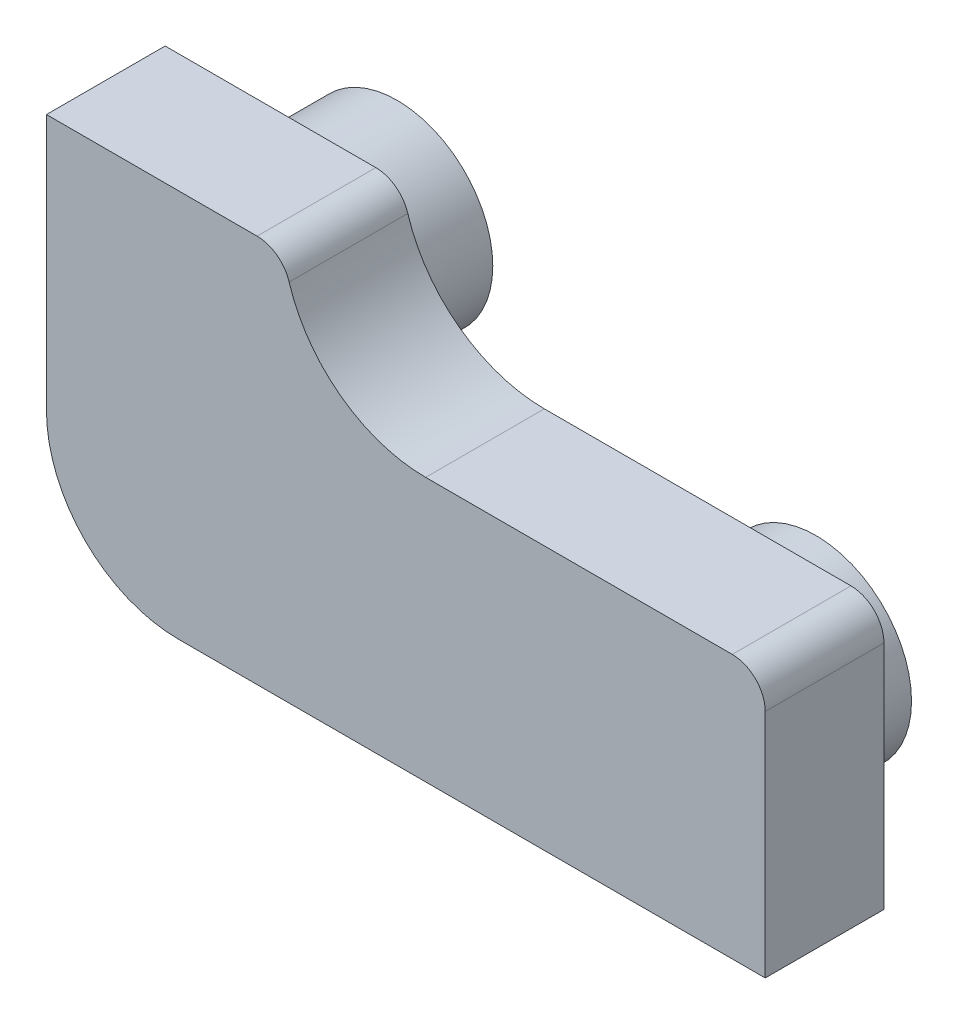
ISO-10303-21;
HEADER;
FILE_DESCRIPTION(('STEP AP214'),'2;1');
FILE_NAME('part.step','',(''),(''),'','','');
FILE_SCHEMA(('AUTOMOTIVE_DESIGN { 1 0 10303 214 1 1 1 1 }'));
ENDSEC;
DATA;
#1=APPLICATION_CONTEXT('core data for automotive mechanical design processes');
#2=APPLICATION_PROTOCOL_DEFINITION('international standard','automotive_design',2000,#1);
#3=PRODUCT_CONTEXT('',#1,'mechanical');
#4=PRODUCT('Part','Part','',(#3));
#5=PRODUCT_RELATED_PRODUCT_CATEGORY('part','',(#4));
#6=PRODUCT_DEFINITION_FORMATION('','',#4);
#7=PRODUCT_DEFINITION_CONTEXT('part definition',#1,'design');
#8=PRODUCT_DEFINITION('design','',#6,#7);
#9=PRODUCT_DEFINITION_SHAPE('','',#8);
#10=(LENGTH_UNIT() NAMED_UNIT(*) SI_UNIT(.MILLI.,.METRE.));
#11=(NAMED_UNIT(*) PLANE_ANGLE_UNIT() SI_UNIT($,.RADIAN.));
#12=(NAMED_UNIT(*) SI_UNIT($,.STERADIAN.) SOLID_ANGLE_UNIT());
#13=UNCERTAINTY_MEASURE_WITH_UNIT(LENGTH_MEASURE(1.E-05),#10,'distance_accuracy_value','');
#14=(GEOMETRIC_REPRESENTATION_CONTEXT(3) GLOBAL_UNCERTAINTY_ASSIGNED_CONTEXT((#13)) GLOBAL_UNIT_ASSIGNED_CONTEXT((#10,
#11,#12)) REPRESENTATION_CONTEXT('',''));
#15=CARTESIAN_POINT('',(0.,0.,0.));
#16=DIRECTION('',(0.,0.,1.));
#17=DIRECTION('',(1.,0.,0.));
#18=AXIS2_PLACEMENT_3D('',#15,#16,#17);
#19=CARTESIAN_POINT('',(2.54,-5.08,-1.25));
#20=DIRECTION('',(0.,0.,1.));
#21=DIRECTION('',(1.,0.,0.));
#22=AXIS2_PLACEMENT_3D('',#19,#20,#21);
#23=PLANE('',#22);
#24=CARTESIAN_POINT('',(2.54,-5.08,-1.25));
#25=DIRECTION('',(0.,0.,1.));
#26=DIRECTION('',(1.,0.,0.));
#27=AXIS2_PLACEMENT_3D('',#24,#25,#26);
#28=CIRCLE('',#27,1.45);
#29=CARTESIAN_POINT('',(3.99,-5.08,-1.25));
#30=VERTEX_POINT('',#29);
#31=EDGE_CURVE('E19',#30,#30,#28,.T.);
#32=ORIENTED_EDGE('',*,*,#31,.F.);
#33=EDGE_LOOP('',(#32));
#34=FACE_BOUND('',#33,.T.);
#35=ADVANCED_FACE('F16',(#34),#23,.F.);
#36=CARTESIAN_POINT('',(-3.81,-2.54,-1.25));
#37=DIRECTION('',(0.,0.,1.));
#38=DIRECTION('',(1.,0.,0.));
#39=AXIS2_PLACEMENT_3D('',#36,#37,#38);
#40=PLANE('',#39);
#41=CARTESIAN_POINT('',(-3.81,-2.54,-1.25));
#42=DIRECTION('',(0.,0.,1.));
#43=DIRECTION('',(1.,0.,0.));
#44=AXIS2_PLACEMENT_3D('',#41,#42,#43);
#45=CIRCLE('',#44,1.45);
#46=CARTESIAN_POINT('',(-2.36,-2.54,-1.25));
#47=VERTEX_POINT('',#46);
#48=EDGE_CURVE('E156',#47,#47,#45,.T.);
#49=ORIENTED_EDGE('',*,*,#48,.F.);
#50=EDGE_LOOP('',(#49));
#51=FACE_BOUND('',#50,.T.);
#52=ADVANCED_FACE('F166',(#51),#40,.F.);
#53=CARTESIAN_POINT('',(2.54,-5.08,-1.25));
#54=DIRECTION('',(0.,0.,1.));
#55=DIRECTION('',(1.,0.,0.));
#56=AXIS2_PLACEMENT_3D('',#53,#54,#55);
#57=CYLINDRICAL_SURFACE('',#56,1.45);
#58=CARTESIAN_POINT('',(2.54,-5.08,0.));
#59=DIRECTION('',(0.,0.,1.));
#60=DIRECTION('',(1.,0.,0.));
#61=AXIS2_PLACEMENT_3D('',#58,#59,#60);
#62=CIRCLE('',#61,1.45);
#63=CARTESIAN_POINT('',(3.99,-5.08,0.));
#64=VERTEX_POINT('',#63);
#65=EDGE_CURVE('E151',#64,#64,#62,.T.);
#66=ORIENTED_EDGE('',*,*,#65,.F.);
#67=EDGE_LOOP('',(#66));
#68=FACE_BOUND('',#67,.T.);
#69=ORIENTED_EDGE('',*,*,#31,.T.);
#70=EDGE_LOOP('',(#69));
#71=FACE_BOUND('',#70,.T.);
#72=ADVANCED_FACE('F163',(#68,#71),#57,.T.);
#73=CARTESIAN_POINT('',(-3.81,-2.54,-1.25));
#74=DIRECTION('',(0.,0.,1.));
#75=DIRECTION('',(1.,0.,0.));
#76=AXIS2_PLACEMENT_3D('',#73,#74,#75);
#77=CYLINDRICAL_SURFACE('',#76,1.45);
#78=ORIENTED_EDGE('',*,*,#48,.T.);
#79=EDGE_LOOP('',(#78));
#80=FACE_BOUND('',#79,.T.);
#81=CARTESIAN_POINT('',(-3.81,-2.54,0.));
#82=DIRECTION('',(0.,0.,1.));
#83=DIRECTION('',(1.,0.,0.));
#84=AXIS2_PLACEMENT_3D('',#81,#82,#83);
#85=CIRCLE('',#84,1.45);
#86=CARTESIAN_POINT('',(-2.36,-2.54,0.));
#87=VERTEX_POINT('',#86);
#88=EDGE_CURVE('E148',#87,#87,#85,.T.);
#89=ORIENTED_EDGE('',*,*,#88,.F.);
#90=EDGE_LOOP('',(#89));
#91=FACE_BOUND('',#90,.T.);
#92=ADVANCED_FACE('F212',(#80,#91),#77,.T.);
#93=CARTESIAN_POINT('',(-2.88432518583022,-1.39419157621007,1.8));
#94=DIRECTION('',(0.,0.,-1.));
#95=DIRECTION('',(-1.,0.,0.));
#96=AXIS2_PLACEMENT_3D('',#93,#94,#95);
#97=CYLINDRICAL_SURFACE('',#96,0.508);
#98=CARTESIAN_POINT('',(-2.88432518583022,-1.39419157621007,1.8));
#99=DIRECTION('',(0.,0.,-1.));
#100=DIRECTION('',(-1.,0.,0.));
#101=AXIS2_PLACEMENT_3D('',#98,#99,#100);
#102=CIRCLE('',#101,0.508);
#103=CARTESIAN_POINT('',(-2.88432518583022,-0.886191576210072,1.8));
#104=VERTEX_POINT('',#103);
#105=CARTESIAN_POINT('',(-2.39862159120643,-1.24534259848589,1.8));
#106=VERTEX_POINT('',#105);
#107=EDGE_CURVE('E78',#104,#106,#102,.T.);
#108=ORIENTED_EDGE('',*,*,#107,.T.);
#109=DIRECTION('',(0.,0.,-1.));
#110=VECTOR('',#109,1.);
#111=CARTESIAN_POINT('',(-2.39862159120643,-1.24534259848589,1.8));
#112=LINE('',#111,#110);
#113=CARTESIAN_POINT('',(-2.39862159120643,-1.24534259848589,0.));
#114=VERTEX_POINT('',#113);
#115=EDGE_CURVE('E99',#106,#114,#112,.T.);
#116=ORIENTED_EDGE('',*,*,#115,.T.);
#117=CARTESIAN_POINT('',(-2.88432518583022,-1.39419157621007,0.));
#118=DIRECTION('',(0.,0.,-1.));
#119=DIRECTION('',(-1.,0.,0.));
#120=AXIS2_PLACEMENT_3D('',#117,#118,#119);
#121=CIRCLE('',#120,0.508);
#122=CARTESIAN_POINT('',(-2.88432518583022,-0.886191576210072,0.));
#123=VERTEX_POINT('',#122);
#124=EDGE_CURVE('E146',#123,#114,#121,.T.);
#125=ORIENTED_EDGE('',*,*,#124,.F.);
#126=DIRECTION('',(0.,0.,1.));
#127=VECTOR('',#126,1.);
#128=CARTESIAN_POINT('',(-2.88432518583022,-0.886191576210072,1.8));
#129=LINE('',#128,#127);
#130=EDGE_CURVE('E95',#123,#104,#129,.T.);
#131=ORIENTED_EDGE('',*,*,#130,.T.);
#132=EDGE_LOOP('',(#108,#116,#125,#131));
#133=FACE_BOUND('',#132,.T.);
#134=ADVANCED_FACE('F208',(#133),#97,.T.);
#135=CARTESIAN_POINT('',(4.3216463606853,-3.27619157621007,1.8));
#136=DIRECTION('',(0.,0.,-1.));
#137=DIRECTION('',(-1.,0.,0.));
#138=AXIS2_PLACEMENT_3D('',#135,#136,#137);
#139=CYLINDRICAL_SURFACE('',#138,0.5);
#140=CARTESIAN_POINT('',(4.3216463606853,-3.27619157621007,1.8));
#141=DIRECTION('',(0.,0.,-1.));
#142=DIRECTION('',(-1.,0.,0.));
#143=AXIS2_PLACEMENT_3D('',#140,#141,#142);
#144=CIRCLE('',#143,0.5);
#145=CARTESIAN_POINT('',(4.3216463606853,-2.77619157621007,1.8));
#146=VERTEX_POINT('',#145);
#147=CARTESIAN_POINT('',(4.8216463606853,-3.27619157621007,1.8));
#148=VERTEX_POINT('',#147);
#149=EDGE_CURVE('E154',#146,#148,#144,.T.);
#150=ORIENTED_EDGE('',*,*,#149,.T.);
#151=DIRECTION('',(0.,0.,1.));
#152=VECTOR('',#151,1.);
#153=CARTESIAN_POINT('',(4.8216463606853,-3.27619157621007,1.8));
#154=LINE('',#153,#152);
#155=CARTESIAN_POINT('',(4.8216463606853,-3.27619157621007,0.));
#156=VERTEX_POINT('',#155);
#157=EDGE_CURVE('E127',#148,#156,#154,.F.);
#158=ORIENTED_EDGE('',*,*,#157,.T.);
#159=CARTESIAN_POINT('',(4.3216463606853,-3.27619157621007,0.));
#160=DIRECTION('',(0.,0.,-1.));
#161=DIRECTION('',(-1.,0.,0.));
#162=AXIS2_PLACEMENT_3D('',#159,#160,#161);
#163=CIRCLE('',#162,0.5);
#164=CARTESIAN_POINT('',(4.3216463606853,-2.77619157621007,0.));
#165=VERTEX_POINT('',#164);
#166=EDGE_CURVE('E144',#165,#156,#163,.T.);
#167=ORIENTED_EDGE('',*,*,#166,.F.);
#168=DIRECTION('',(0.,0.,-1.));
#169=VECTOR('',#168,1.);
#170=CARTESIAN_POINT('',(4.3216463606853,-2.77619157621007,1.8));
#171=LINE('',#170,#169);
#172=EDGE_CURVE('E143',#165,#146,#171,.F.);
#173=ORIENTED_EDGE('',*,*,#172,.T.);
#174=EDGE_LOOP('',(#150,#158,#167,#173));
#175=FACE_BOUND('',#174,.T.);
#176=ADVANCED_FACE('F205',(#175),#139,.T.);
#177=CARTESIAN_POINT('',(-2.88432518583022,-1.39419157621007,0.));
#178=DIRECTION('',(0.,0.,-1.));
#179=DIRECTION('',(-1.,0.,0.));
#180=AXIS2_PLACEMENT_3D('',#177,#178,#179);
#181=PLANE('',#180);
#182=DIRECTION('',(-1.,0.,0.));
#183=VECTOR('',#182,1.);
#184=CARTESIAN_POINT('',(4.8216463606853,-6.77619157621007,0.));
#185=LINE('',#184,#183);
#186=CARTESIAN_POINT('',(4.8216463606853,-6.77619157621007,0.));
#187=VERTEX_POINT('',#186);
#188=CARTESIAN_POINT('',(-4.07835363931469,-6.77619157621007,0.));
#189=VERTEX_POINT('',#188);
#190=EDGE_CURVE('E120',#187,#189,#185,.T.);
#191=ORIENTED_EDGE('',*,*,#190,.T.);
#192=CARTESIAN_POINT('',(-4.0783536393147,-4.77619157621007,0.));
#193=DIRECTION('',(0.,0.,-1.));
#194=DIRECTION('',(-1.,0.,0.));
#195=AXIS2_PLACEMENT_3D('',#192,#193,#194);
#196=CIRCLE('',#195,2.);
#197=CARTESIAN_POINT('',(-6.0783536393147,-4.77619157621006,0.));
#198=VERTEX_POINT('',#197);
#199=EDGE_CURVE('E108',#198,#189,#196,.F.);
#200=ORIENTED_EDGE('',*,*,#199,.F.);
#201=DIRECTION('',(0.,1.,0.));
#202=VECTOR('',#201,1.);
#203=CARTESIAN_POINT('',(-6.0783536393147,-4.77619157621006,0.));
#204=LINE('',#203,#202);
#205=CARTESIAN_POINT('',(-6.0783536393147,-0.886191576210072,0.));
#206=VERTEX_POINT('',#205);
#207=EDGE_CURVE('E102',#198,#206,#204,.T.);
#208=ORIENTED_EDGE('',*,*,#207,.T.);
#209=DIRECTION('',(1.,0.,0.));
#210=VECTOR('',#209,1.);
#211=CARTESIAN_POINT('',(-6.0783536393147,-0.886191576210072,0.));
#212=LINE('',#211,#210);
#213=EDGE_CURVE('E91',#206,#123,#212,.T.);
#214=ORIENTED_EDGE('',*,*,#213,.T.);
#215=ORIENTED_EDGE('',*,*,#124,.T.);
#216=CARTESIAN_POINT('',(-0.328353639314698,-0.61088719880347,0.));
#217=DIRECTION('',(0.,0.,-1.));
#218=DIRECTION('',(-1.,0.,0.));
#219=AXIS2_PLACEMENT_3D('',#216,#217,#218);
#220=CIRCLE('',#219,2.1653043774066);
#221=CARTESIAN_POINT('',(-0.328353639314698,-2.77619157621007,0.));
#222=VERTEX_POINT('',#221);
#223=EDGE_CURVE('E141',#114,#222,#220,.F.);
#224=ORIENTED_EDGE('',*,*,#223,.T.);
#225=DIRECTION('',(1.,0.,0.));
#226=VECTOR('',#225,1.);
#227=CARTESIAN_POINT('',(-0.328353639314698,-2.77619157621007,0.));
#228=LINE('',#227,#226);
#229=EDGE_CURVE('E130',#222,#165,#228,.T.);
#230=ORIENTED_EDGE('',*,*,#229,.T.);
#231=ORIENTED_EDGE('',*,*,#166,.T.);
#232=DIRECTION('',(0.,1.,0.));
#233=VECTOR('',#232,1.);
#234=CARTESIAN_POINT('',(4.8216463606853,-3.27619157621007,0.));
#235=LINE('',#234,#233);
#236=EDGE_CURVE('E125',#156,#187,#235,.F.);
#237=ORIENTED_EDGE('',*,*,#236,.T.);
#238=EDGE_LOOP('',(#191,#200,#208,#214,#215,#224,#230,#231,#237));
#239=FACE_BOUND('',#238,.T.);
#240=ORIENTED_EDGE('',*,*,#88,.T.);
#241=EDGE_LOOP('',(#240));
#242=FACE_BOUND('',#241,.T.);
#243=ORIENTED_EDGE('',*,*,#65,.T.);
#244=EDGE_LOOP('',(#243));
#245=FACE_BOUND('',#244,.T.);
#246=ADVANCED_FACE('F106',(#239,#242,#245),#181,.T.);
#247=CARTESIAN_POINT('',(-6.0783536393147,-0.886191576210072,1.8));
#248=DIRECTION('',(0.,-1.,0.));
#249=DIRECTION('',(1.,0.,0.));
#250=AXIS2_PLACEMENT_3D('',#247,#248,#249);
#251=PLANE('',#250);
#252=DIRECTION('',(0.,0.,-1.));
#253=VECTOR('',#252,1.);
#254=CARTESIAN_POINT('',(-6.0783536393147,-0.886191576210072,1.8));
#255=LINE('',#254,#253);
#256=CARTESIAN_POINT('',(-6.0783536393147,-0.886191576210072,1.8));
#257=VERTEX_POINT('',#256);
#258=EDGE_CURVE('E94',#206,#257,#255,.F.);
#259=ORIENTED_EDGE('',*,*,#258,.T.);
#260=DIRECTION('',(-1.,0.,0.));
#261=VECTOR('',#260,1.);
#262=CARTESIAN_POINT('',(-2.88432518583022,-0.886191576210072,1.8));
#263=LINE('',#262,#261);
#264=EDGE_CURVE('E82',#257,#104,#263,.F.);
#265=ORIENTED_EDGE('',*,*,#264,.T.);
#266=ORIENTED_EDGE('',*,*,#130,.F.);
#267=ORIENTED_EDGE('',*,*,#213,.F.);
#268=EDGE_LOOP('',(#259,#265,#266,#267));
#269=FACE_BOUND('',#268,.T.);
#270=ADVANCED_FACE('F93',(#269),#251,.F.);
#271=CARTESIAN_POINT('',(-0.328353639314698,-0.61088719880347,1.8));
#272=DIRECTION('',(0.,0.,-1.));
#273=DIRECTION('',(-1.,0.,0.));
#274=AXIS2_PLACEMENT_3D('',#271,#272,#273);
#275=CYLINDRICAL_SURFACE('',#274,2.1653043774066);
#276=ORIENTED_EDGE('',*,*,#115,.F.);
#277=CARTESIAN_POINT('',(-0.328353639314698,-0.61088719880347,1.8));
#278=DIRECTION('',(0.,0.,-1.));
#279=DIRECTION('',(-1.,0.,0.));
#280=AXIS2_PLACEMENT_3D('',#277,#278,#279);
#281=CIRCLE('',#280,2.1653043774066);
#282=CARTESIAN_POINT('',(-0.328353639314698,-2.77619157621007,1.8));
#283=VERTEX_POINT('',#282);
#284=EDGE_CURVE('E110',#106,#283,#281,.F.);
#285=ORIENTED_EDGE('',*,*,#284,.T.);
#286=DIRECTION('',(0.,0.,-1.));
#287=VECTOR('',#286,1.);
#288=CARTESIAN_POINT('',(-0.328353639314698,-2.77619157621007,1.8));
#289=LINE('',#288,#287);
#290=EDGE_CURVE('E133',#283,#222,#289,.T.);
#291=ORIENTED_EDGE('',*,*,#290,.T.);
#292=ORIENTED_EDGE('',*,*,#223,.F.);
#293=EDGE_LOOP('',(#276,#285,#291,#292));
#294=FACE_BOUND('',#293,.T.);
#295=ADVANCED_FACE('F196',(#294),#275,.F.);
#296=CARTESIAN_POINT('',(-0.328353639314698,-2.77619157621007,1.8));
#297=DIRECTION('',(0.,-1.,0.));
#298=DIRECTION('',(0.,0.,-1.));
#299=AXIS2_PLACEMENT_3D('',#296,#297,#298);
#300=PLANE('',#299);
#301=ORIENTED_EDGE('',*,*,#290,.F.);
#302=DIRECTION('',(-1.,0.,0.));
#303=VECTOR('',#302,1.);
#304=CARTESIAN_POINT('',(-2.88432518583022,-2.77619157621007,1.8));
#305=LINE('',#304,#303);
#306=EDGE_CURVE('E139',#283,#146,#305,.F.);
#307=ORIENTED_EDGE('',*,*,#306,.T.);
#308=ORIENTED_EDGE('',*,*,#172,.F.);
#309=ORIENTED_EDGE('',*,*,#229,.F.);
#310=EDGE_LOOP('',(#301,#307,#308,#309));
#311=FACE_BOUND('',#310,.T.);
#312=ADVANCED_FACE('F192',(#311),#300,.F.);
#313=CARTESIAN_POINT('',(4.8216463606853,-3.27619157621007,1.8));
#314=DIRECTION('',(-1.,0.,0.));
#315=DIRECTION('',(0.,0.,1.));
#316=AXIS2_PLACEMENT_3D('',#313,#314,#315);
#317=PLANE('',#316);
#318=ORIENTED_EDGE('',*,*,#157,.F.);
#319=DIRECTION('',(0.,1.,0.));
#320=VECTOR('',#319,1.);
#321=CARTESIAN_POINT('',(4.8216463606853,-1.39419157621007,1.8));
#322=LINE('',#321,#320);
#323=CARTESIAN_POINT('',(4.8216463606853,-6.77619157621007,1.8));
#324=VERTEX_POINT('',#323);
#325=EDGE_CURVE('E328',#148,#324,#322,.F.);
#326=ORIENTED_EDGE('',*,*,#325,.T.);
#327=DIRECTION('',(0.,0.,1.));
#328=VECTOR('',#327,1.);
#329=CARTESIAN_POINT('',(4.8216463606853,-6.77619157621007,1.8));
#330=LINE('',#329,#328);
#331=EDGE_CURVE('E122',#324,#187,#330,.F.);
#332=ORIENTED_EDGE('',*,*,#331,.T.);
#333=ORIENTED_EDGE('',*,*,#236,.F.);
#334=EDGE_LOOP('',(#318,#326,#332,#333));
#335=FACE_BOUND('',#334,.T.);
#336=ADVANCED_FACE('F188',(#335),#317,.F.);
#337=CARTESIAN_POINT('',(4.8216463606853,-6.77619157621007,1.8));
#338=DIRECTION('',(0.,1.,0.));
#339=DIRECTION('',(-1.,0.,0.));
#340=AXIS2_PLACEMENT_3D('',#337,#338,#339);
#341=PLANE('',#340);
#342=ORIENTED_EDGE('',*,*,#331,.F.);
#343=DIRECTION('',(-1.,0.,0.));
#344=VECTOR('',#343,1.);
#345=CARTESIAN_POINT('',(-2.88432518583022,-6.77619157621007,1.8));
#346=LINE('',#345,#344);
#347=CARTESIAN_POINT('',(-4.07835363931469,-6.77619157621007,1.8));
#348=VERTEX_POINT('',#347);
#349=EDGE_CURVE('E136',#324,#348,#346,.T.);
#350=ORIENTED_EDGE('',*,*,#349,.T.);
#351=DIRECTION('',(0.,0.,-1.));
#352=VECTOR('',#351,1.);
#353=CARTESIAN_POINT('',(-4.07835363931468,-6.77619157621007,1.8));
#354=LINE('',#353,#352);
#355=EDGE_CURVE('E103',#189,#348,#354,.F.);
#356=ORIENTED_EDGE('',*,*,#355,.F.);
#357=ORIENTED_EDGE('',*,*,#190,.F.);
#358=EDGE_LOOP('',(#342,#350,#356,#357));
#359=FACE_BOUND('',#358,.T.);
#360=ADVANCED_FACE('F184',(#359),#341,.F.);
#361=CARTESIAN_POINT('',(-4.0783536393147,-4.77619157621007,1.8));
#362=DIRECTION('',(0.,0.,-1.));
#363=DIRECTION('',(-1.,0.,0.));
#364=AXIS2_PLACEMENT_3D('',#361,#362,#363);
#365=CYLINDRICAL_SURFACE('',#364,2.);
#366=CARTESIAN_POINT('',(-4.0783536393147,-4.77619157621007,1.8));
#367=DIRECTION('',(0.,0.,-1.));
#368=DIRECTION('',(-1.,0.,0.));
#369=AXIS2_PLACEMENT_3D('',#366,#367,#368);
#370=CIRCLE('',#369,2.);
#371=CARTESIAN_POINT('',(-6.0783536393147,-4.77619157621006,1.8));
#372=VERTEX_POINT('',#371);
#373=EDGE_CURVE('E25',#348,#372,#370,.T.);
#374=ORIENTED_EDGE('',*,*,#373,.T.);
#375=DIRECTION('',(0.,0.,-1.));
#376=VECTOR('',#375,1.);
#377=CARTESIAN_POINT('',(-6.0783536393147,-4.77619157621006,1.8));
#378=LINE('',#377,#376);
#379=EDGE_CURVE('E33',#372,#198,#378,.T.);
#380=ORIENTED_EDGE('',*,*,#379,.T.);
#381=ORIENTED_EDGE('',*,*,#199,.T.);
#382=ORIENTED_EDGE('',*,*,#355,.T.);
#383=EDGE_LOOP('',(#374,#380,#381,#382));
#384=FACE_BOUND('',#383,.T.);
#385=ADVANCED_FACE('F178',(#384),#365,.T.);
#386=CARTESIAN_POINT('',(-6.0783536393147,-4.77619157621006,1.8));
#387=DIRECTION('',(1.,0.,0.));
#388=DIRECTION('',(0.,0.,-1.));
#389=AXIS2_PLACEMENT_3D('',#386,#387,#388);
#390=PLANE('',#389);
#391=ORIENTED_EDGE('',*,*,#379,.F.);
#392=DIRECTION('',(0.,1.,0.));
#393=VECTOR('',#392,1.);
#394=CARTESIAN_POINT('',(-6.0783536393147,-1.39419157621007,1.8));
#395=LINE('',#394,#393);
#396=EDGE_CURVE('E11',#372,#257,#395,.T.);
#397=ORIENTED_EDGE('',*,*,#396,.T.);
#398=ORIENTED_EDGE('',*,*,#258,.F.);
#399=ORIENTED_EDGE('',*,*,#207,.F.);
#400=EDGE_LOOP('',(#391,#397,#398,#399));
#401=FACE_BOUND('',#400,.T.);
#402=ADVANCED_FACE('F101',(#401),#390,.F.);
#403=CARTESIAN_POINT('',(-2.88432518583022,-1.39419157621007,1.8));
#404=DIRECTION('',(0.,0.,-1.));
#405=DIRECTION('',(-1.,0.,0.));
#406=AXIS2_PLACEMENT_3D('',#403,#404,#405);
#407=PLANE('',#406);
#408=ORIENTED_EDGE('',*,*,#373,.F.);
#409=ORIENTED_EDGE('',*,*,#349,.F.);
#410=ORIENTED_EDGE('',*,*,#325,.F.);
#411=ORIENTED_EDGE('',*,*,#149,.F.);
#412=ORIENTED_EDGE('',*,*,#306,.F.);
#413=ORIENTED_EDGE('',*,*,#284,.F.);
#414=ORIENTED_EDGE('',*,*,#107,.F.);
#415=ORIENTED_EDGE('',*,*,#264,.F.);
#416=ORIENTED_EDGE('',*,*,#396,.F.);
#417=EDGE_LOOP('',(#408,#409,#410,#411,#412,#413,#414,#415,#416));
#418=FACE_BOUND('',#417,.T.);
#419=ADVANCED_FACE('F172',(#418),#407,.F.);
#420=CLOSED_SHELL('',(#35,#52,#72,#92,#134,#176,#246,#270,#295,#312,#336,#360,#385,#402,#419));
#421=MANIFOLD_SOLID_BREP('B1',#420);
#422=ADVANCED_BREP_SHAPE_REPRESENTATION('',(#18,#421),#14);
#423=SHAPE_DEFINITION_REPRESENTATION(#9,#422);
ENDSEC;
END-ISO-10303-21;
